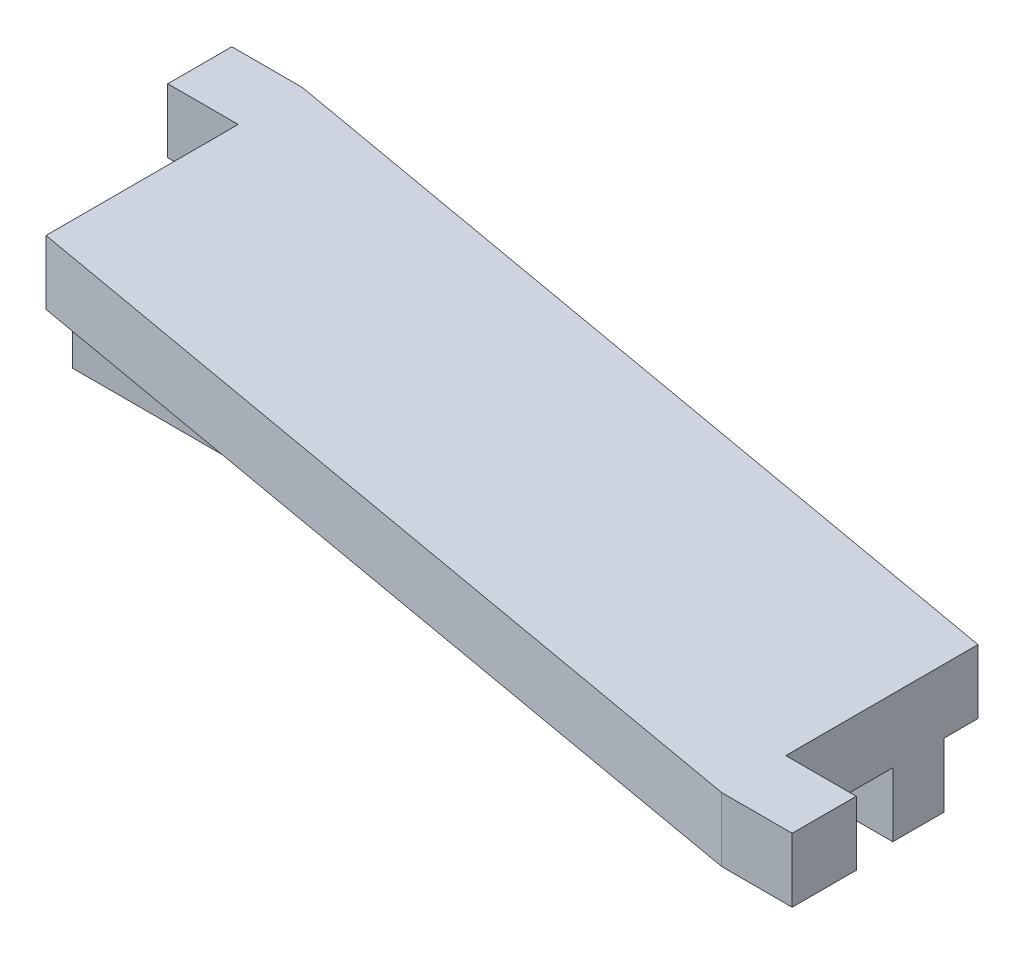
ISO-10303-21;
HEADER;
FILE_DESCRIPTION(('STEP AP214'),'2;1');
FILE_NAME('part.step','',(''),(''),'','','');
FILE_SCHEMA(('AUTOMOTIVE_DESIGN { 1 0 10303 214 1 1 1 1 }'));
ENDSEC;
DATA;
#1=APPLICATION_CONTEXT('core data for automotive mechanical design processes');
#2=APPLICATION_PROTOCOL_DEFINITION('international standard','automotive_design',2000,#1);
#3=PRODUCT_CONTEXT('',#1,'mechanical');
#4=PRODUCT('Part','Part','',(#3));
#5=PRODUCT_RELATED_PRODUCT_CATEGORY('part','',(#4));
#6=PRODUCT_DEFINITION_FORMATION('','',#4);
#7=PRODUCT_DEFINITION_CONTEXT('part definition',#1,'design');
#8=PRODUCT_DEFINITION('design','',#6,#7);
#9=PRODUCT_DEFINITION_SHAPE('','',#8);
#10=(LENGTH_UNIT() NAMED_UNIT(*) SI_UNIT(.MILLI.,.METRE.));
#11=(NAMED_UNIT(*) PLANE_ANGLE_UNIT() SI_UNIT($,.RADIAN.));
#12=(NAMED_UNIT(*) SI_UNIT($,.STERADIAN.) SOLID_ANGLE_UNIT());
#13=UNCERTAINTY_MEASURE_WITH_UNIT(LENGTH_MEASURE(1.E-05),#10,'distance_accuracy_value','');
#14=(GEOMETRIC_REPRESENTATION_CONTEXT(3) GLOBAL_UNCERTAINTY_ASSIGNED_CONTEXT((#13)) GLOBAL_UNIT_ASSIGNED_CONTEXT((#10,
#11,#12)) REPRESENTATION_CONTEXT('',''));
#15=CARTESIAN_POINT('',(0.,0.,0.));
#16=DIRECTION('',(0.,0.,1.));
#17=DIRECTION('',(1.,0.,0.));
#18=AXIS2_PLACEMENT_3D('',#15,#16,#17);
#19=CARTESIAN_POINT('',(0.,0.,0.));
#20=DIRECTION('',(0.,-1.,0.));
#21=DIRECTION('',(0.,0.,-1.));
#22=AXIS2_PLACEMENT_3D('',#19,#20,#21);
#23=PLANE('',#22);
#24=DIRECTION('',(1.,0.,0.));
#25=VECTOR('',#24,1.);
#26=CARTESIAN_POINT('',(0.,0.,-34.7));
#27=LINE('',#26,#25);
#28=CARTESIAN_POINT('',(-128.025007891587,0.,-34.7));
#29=VERTEX_POINT('',#28);
#30=CARTESIAN_POINT('',(0.,0.,-34.7));
#31=VERTEX_POINT('',#30);
#32=EDGE_CURVE('E171',#29,#31,#27,.T.);
#33=ORIENTED_EDGE('',*,*,#32,.F.);
#34=DIRECTION('',(0.,0.,1.));
#35=VECTOR('',#34,1.);
#36=CARTESIAN_POINT('',(-128.025007891587,0.,-22.574263096701));
#37=LINE('',#36,#35);
#38=CARTESIAN_POINT('',(-128.025007891587,0.,-52.5742630967009));
#39=VERTEX_POINT('',#38);
#40=EDGE_CURVE('E241',#39,#29,#37,.T.);
#41=ORIENTED_EDGE('',*,*,#40,.F.);
#42=DIRECTION('',(1.,0.,0.));
#43=VECTOR('',#42,1.);
#44=CARTESIAN_POINT('',(-128.025007891587,0.,-52.5742630967009));
#45=LINE('',#44,#43);
#46=CARTESIAN_POINT('',(-139.025007891587,0.,-52.5742630967009));
#47=VERTEX_POINT('',#46);
#48=EDGE_CURVE('E237',#47,#39,#45,.T.);
#49=ORIENTED_EDGE('',*,*,#48,.F.);
#50=DIRECTION('',(0.,0.,1.));
#51=VECTOR('',#50,1.);
#52=CARTESIAN_POINT('',(-139.025007891587,0.,-52.5742630967009));
#53=LINE('',#52,#51);
#54=CARTESIAN_POINT('',(-139.025007891587,0.,-62.5742630967009));
#55=VERTEX_POINT('',#54);
#56=EDGE_CURVE('E234',#55,#47,#53,.T.);
#57=ORIENTED_EDGE('',*,*,#56,.F.);
#58=DIRECTION('',(-1.,0.,0.));
#59=VECTOR('',#58,1.);
#60=CARTESIAN_POINT('',(-139.025007891587,0.,-62.5742630967009));
#61=LINE('',#60,#59);
#62=CARTESIAN_POINT('',(-128.025007891587,0.,-62.5742630967009));
#63=VERTEX_POINT('',#62);
#64=EDGE_CURVE('E231',#63,#55,#61,.T.);
#65=ORIENTED_EDGE('',*,*,#64,.F.);
#66=DIRECTION('',(-0.984807753012208,0.,-0.17364817766693));
#67=VECTOR('',#66,1.);
#68=CARTESIAN_POINT('',(-128.025007891587,0.,-62.5742630967009));
#69=LINE('',#68,#67);
#70=CARTESIAN_POINT('',(0.,0.,-40.));
#71=VERTEX_POINT('',#70);
#72=EDGE_CURVE('E228',#71,#63,#69,.T.);
#73=ORIENTED_EDGE('',*,*,#72,.F.);
#74=DIRECTION('',(0.,0.,-1.));
#75=VECTOR('',#74,1.);
#76=CARTESIAN_POINT('',(0.,0.,-40.));
#77=LINE('',#76,#75);
#78=EDGE_CURVE('E63',#31,#71,#77,.T.);
#79=ORIENTED_EDGE('',*,*,#78,.F.);
#80=EDGE_LOOP('',(#33,#41,#49,#57,#65,#73,#79));
#81=FACE_BOUND('',#80,.T.);
#82=ADVANCED_FACE('F47',(#81),#23,.T.);
#83=CARTESIAN_POINT('',(11.,10.,0.));
#84=DIRECTION('',(0.,0.,-1.));
#85=DIRECTION('',(-1.,0.,0.));
#86=AXIS2_PLACEMENT_3D('',#83,#84,#85);
#87=PLANE('',#86);
#88=DIRECTION('',(1.,0.,0.));
#89=VECTOR('',#88,1.);
#90=CARTESIAN_POINT('',(11.,0.,0.));
#91=LINE('',#90,#89);
#92=CARTESIAN_POINT('',(0.,0.,0.));
#93=VERTEX_POINT('',#92);
#94=CARTESIAN_POINT('',(11.,0.,0.));
#95=VERTEX_POINT('',#94);
#96=EDGE_CURVE('E177',#93,#95,#91,.T.);
#97=ORIENTED_EDGE('',*,*,#96,.T.);
#98=DIRECTION('',(0.,-1.,0.));
#99=VECTOR('',#98,1.);
#100=CARTESIAN_POINT('',(11.,10.,0.));
#101=LINE('',#100,#99);
#102=CARTESIAN_POINT('',(11.,10.,0.));
#103=VERTEX_POINT('',#102);
#104=EDGE_CURVE('E11',#103,#95,#101,.T.);
#105=ORIENTED_EDGE('',*,*,#104,.F.);
#106=DIRECTION('',(1.,0.,0.));
#107=VECTOR('',#106,1.);
#108=CARTESIAN_POINT('',(11.,10.,0.));
#109=LINE('',#108,#107);
#110=CARTESIAN_POINT('',(0.,10.,0.));
#111=VERTEX_POINT('',#110);
#112=EDGE_CURVE('E188',#111,#103,#109,.T.);
#113=ORIENTED_EDGE('',*,*,#112,.F.);
#114=DIRECTION('',(0.,-1.,0.));
#115=VECTOR('',#114,1.);
#116=CARTESIAN_POINT('',(0.,10.,0.));
#117=LINE('',#116,#115);
#118=EDGE_CURVE('E219',#111,#93,#117,.T.);
#119=ORIENTED_EDGE('',*,*,#118,.T.);
#120=EDGE_LOOP('',(#97,#105,#113,#119));
#121=FACE_BOUND('',#120,.T.);
#122=ADVANCED_FACE('F49',(#121),#87,.F.);
#123=CARTESIAN_POINT('',(11.,10.,-9.99999999999999));
#124=DIRECTION('',(-1.,0.,0.));
#125=DIRECTION('',(0.,0.,1.));
#126=AXIS2_PLACEMENT_3D('',#123,#124,#125);
#127=PLANE('',#126);
#128=DIRECTION('',(0.,0.,-1.));
#129=VECTOR('',#128,1.);
#130=CARTESIAN_POINT('',(11.,0.,-9.99999999999999));
#131=LINE('',#130,#129);
#132=CARTESIAN_POINT('',(11.,0.,-9.99999999999999));
#133=VERTEX_POINT('',#132);
#134=EDGE_CURVE('E182',#95,#133,#131,.T.);
#135=ORIENTED_EDGE('',*,*,#134,.T.);
#136=DIRECTION('',(0.,-1.,0.));
#137=VECTOR('',#136,1.);
#138=CARTESIAN_POINT('',(11.,10.,-9.99999999999999));
#139=LINE('',#138,#137);
#140=CARTESIAN_POINT('',(11.,10.,-9.99999999999999));
#141=VERTEX_POINT('',#140);
#142=EDGE_CURVE('E56',#141,#133,#139,.T.);
#143=ORIENTED_EDGE('',*,*,#142,.F.);
#144=DIRECTION('',(0.,0.,-1.));
#145=VECTOR('',#144,1.);
#146=CARTESIAN_POINT('',(11.,10.,-9.99999999999999));
#147=LINE('',#146,#145);
#148=EDGE_CURVE('E192',#103,#141,#147,.T.);
#149=ORIENTED_EDGE('',*,*,#148,.F.);
#150=ORIENTED_EDGE('',*,*,#104,.T.);
#151=EDGE_LOOP('',(#135,#143,#149,#150));
#152=FACE_BOUND('',#151,.T.);
#153=ADVANCED_FACE('F289',(#152),#127,.F.);
#154=CARTESIAN_POINT('',(0.,10.,-10.));
#155=DIRECTION('',(0.,0.,1.));
#156=DIRECTION('',(1.,0.,0.));
#157=AXIS2_PLACEMENT_3D('',#154,#155,#156);
#158=PLANE('',#157);
#159=DIRECTION('',(-1.,0.,0.));
#160=VECTOR('',#159,1.);
#161=CARTESIAN_POINT('',(0.,0.,-10.));
#162=LINE('',#161,#160);
#163=CARTESIAN_POINT('',(0.,0.,-10.));
#164=VERTEX_POINT('',#163);
#165=EDGE_CURVE('E223',#133,#164,#162,.T.);
#166=ORIENTED_EDGE('',*,*,#165,.T.);
#167=DIRECTION('',(0.,-1.,0.));
#168=VECTOR('',#167,1.);
#169=CARTESIAN_POINT('',(0.,10.,-10.));
#170=LINE('',#169,#168);
#171=CARTESIAN_POINT('',(0.,10.,-10.));
#172=VERTEX_POINT('',#171);
#173=EDGE_CURVE('E274',#172,#164,#170,.T.);
#174=ORIENTED_EDGE('',*,*,#173,.F.);
#175=DIRECTION('',(-1.,0.,0.));
#176=VECTOR('',#175,1.);
#177=CARTESIAN_POINT('',(0.,10.,-10.));
#178=LINE('',#177,#176);
#179=EDGE_CURVE('E196',#141,#172,#178,.T.);
#180=ORIENTED_EDGE('',*,*,#179,.F.);
#181=ORIENTED_EDGE('',*,*,#142,.T.);
#182=EDGE_LOOP('',(#166,#174,#180,#181));
#183=FACE_BOUND('',#182,.T.);
#184=ADVANCED_FACE('F282',(#183),#158,.F.);
#185=CARTESIAN_POINT('',(0.,10.,-40.));
#186=DIRECTION('',(-1.,0.,0.));
#187=DIRECTION('',(0.,0.,1.));
#188=AXIS2_PLACEMENT_3D('',#185,#186,#187);
#189=PLANE('',#188);
#190=CARTESIAN_POINT('',(0.,0.,-26.7));
#191=VERTEX_POINT('',#190);
#192=EDGE_CURVE('E175',#164,#191,#77,.T.);
#193=ORIENTED_EDGE('',*,*,#192,.T.);
#194=DIRECTION('',(0.,1.,0.));
#195=VECTOR('',#194,1.);
#196=CARTESIAN_POINT('',(0.,-10.,-26.7));
#197=LINE('',#196,#195);
#198=CARTESIAN_POINT('',(0.,-10.,-26.7));
#199=VERTEX_POINT('',#198);
#200=EDGE_CURVE('E154',#199,#191,#197,.T.);
#201=ORIENTED_EDGE('',*,*,#200,.F.);
#202=DIRECTION('',(0.,0.,1.));
#203=VECTOR('',#202,1.);
#204=CARTESIAN_POINT('',(0.,-10.,-34.7));
#205=LINE('',#204,#203);
#206=CARTESIAN_POINT('',(0.,-10.,-34.7));
#207=VERTEX_POINT('',#206);
#208=EDGE_CURVE('E161',#207,#199,#205,.T.);
#209=ORIENTED_EDGE('',*,*,#208,.F.);
#210=DIRECTION('',(0.,1.,0.));
#211=VECTOR('',#210,1.);
#212=CARTESIAN_POINT('',(0.,-10.,-34.7));
#213=LINE('',#212,#211);
#214=EDGE_CURVE('E307',#207,#31,#213,.T.);
#215=ORIENTED_EDGE('',*,*,#214,.T.);
#216=ORIENTED_EDGE('',*,*,#78,.T.);
#217=DIRECTION('',(0.,-1.,0.));
#218=VECTOR('',#217,1.);
#219=CARTESIAN_POINT('',(0.,10.,-40.));
#220=LINE('',#219,#218);
#221=CARTESIAN_POINT('',(0.,10.,-40.));
#222=VERTEX_POINT('',#221);
#223=EDGE_CURVE('E270',#222,#71,#220,.T.);
#224=ORIENTED_EDGE('',*,*,#223,.F.);
#225=DIRECTION('',(0.,0.,-1.));
#226=VECTOR('',#225,1.);
#227=CARTESIAN_POINT('',(0.,10.,-40.));
#228=LINE('',#227,#226);
#229=EDGE_CURVE('E199',#172,#222,#228,.T.);
#230=ORIENTED_EDGE('',*,*,#229,.F.);
#231=ORIENTED_EDGE('',*,*,#173,.T.);
#232=EDGE_LOOP('',(#193,#201,#209,#215,#216,#224,#230,#231));
#233=FACE_BOUND('',#232,.T.);
#234=ADVANCED_FACE('F173',(#233),#189,.F.);
#235=CARTESIAN_POINT('',(-128.025007891587,10.,-62.5742630967009));
#236=DIRECTION('',(-0.17364817766693,0.,0.984807753012208));
#237=DIRECTION('',(0.984807753012208,0.,0.17364817766693));
#238=AXIS2_PLACEMENT_3D('',#235,#236,#237);
#239=PLANE('',#238);
#240=ORIENTED_EDGE('',*,*,#72,.T.);
#241=DIRECTION('',(0.,-1.,0.));
#242=VECTOR('',#241,1.);
#243=CARTESIAN_POINT('',(-128.025007891587,10.,-62.5742630967009));
#244=LINE('',#243,#242);
#245=CARTESIAN_POINT('',(-128.025007891587,10.,-62.5742630967009));
#246=VERTEX_POINT('',#245);
#247=EDGE_CURVE('E266',#246,#63,#244,.T.);
#248=ORIENTED_EDGE('',*,*,#247,.F.);
#249=DIRECTION('',(-0.984807753012208,0.,-0.17364817766693));
#250=VECTOR('',#249,1.);
#251=CARTESIAN_POINT('',(-128.025007891587,10.,-62.5742630967009));
#252=LINE('',#251,#250);
#253=EDGE_CURVE('E202',#222,#246,#252,.T.);
#254=ORIENTED_EDGE('',*,*,#253,.F.);
#255=ORIENTED_EDGE('',*,*,#223,.T.);
#256=EDGE_LOOP('',(#240,#248,#254,#255));
#257=FACE_BOUND('',#256,.T.);
#258=ADVANCED_FACE('F321',(#257),#239,.F.);
#259=CARTESIAN_POINT('',(-139.025007891587,10.,-62.5742630967009));
#260=DIRECTION('',(0.,0.,1.));
#261=DIRECTION('',(1.,0.,0.));
#262=AXIS2_PLACEMENT_3D('',#259,#260,#261);
#263=PLANE('',#262);
#264=ORIENTED_EDGE('',*,*,#64,.T.);
#265=DIRECTION('',(0.,-1.,0.));
#266=VECTOR('',#265,1.);
#267=CARTESIAN_POINT('',(-139.025007891587,10.,-62.5742630967009));
#268=LINE('',#267,#266);
#269=CARTESIAN_POINT('',(-139.025007891587,10.,-62.5742630967009));
#270=VERTEX_POINT('',#269);
#271=EDGE_CURVE('E262',#270,#55,#268,.T.);
#272=ORIENTED_EDGE('',*,*,#271,.F.);
#273=DIRECTION('',(-1.,0.,0.));
#274=VECTOR('',#273,1.);
#275=CARTESIAN_POINT('',(-139.025007891587,10.,-62.5742630967009));
#276=LINE('',#275,#274);
#277=EDGE_CURVE('E205',#246,#270,#276,.T.);
#278=ORIENTED_EDGE('',*,*,#277,.F.);
#279=ORIENTED_EDGE('',*,*,#247,.T.);
#280=EDGE_LOOP('',(#264,#272,#278,#279));
#281=FACE_BOUND('',#280,.T.);
#282=ADVANCED_FACE('F328',(#281),#263,.F.);
#283=CARTESIAN_POINT('',(-139.025007891587,10.,-52.5742630967009));
#284=DIRECTION('',(1.,0.,0.));
#285=DIRECTION('',(0.,0.,-1.));
#286=AXIS2_PLACEMENT_3D('',#283,#284,#285);
#287=PLANE('',#286);
#288=ORIENTED_EDGE('',*,*,#56,.T.);
#289=DIRECTION('',(0.,-1.,0.));
#290=VECTOR('',#289,1.);
#291=CARTESIAN_POINT('',(-139.025007891587,10.,-52.5742630967009));
#292=LINE('',#291,#290);
#293=CARTESIAN_POINT('',(-139.025007891587,10.,-52.5742630967009));
#294=VERTEX_POINT('',#293);
#295=EDGE_CURVE('E258',#294,#47,#292,.T.);
#296=ORIENTED_EDGE('',*,*,#295,.F.);
#297=DIRECTION('',(0.,0.,1.));
#298=VECTOR('',#297,1.);
#299=CARTESIAN_POINT('',(-139.025007891587,10.,-52.5742630967009));
#300=LINE('',#299,#298);
#301=EDGE_CURVE('E208',#270,#294,#300,.T.);
#302=ORIENTED_EDGE('',*,*,#301,.F.);
#303=ORIENTED_EDGE('',*,*,#271,.T.);
#304=EDGE_LOOP('',(#288,#296,#302,#303));
#305=FACE_BOUND('',#304,.T.);
#306=ADVANCED_FACE('F332',(#305),#287,.F.);
#307=CARTESIAN_POINT('',(-128.025007891587,10.,-52.5742630967009));
#308=DIRECTION('',(0.,0.,-1.));
#309=DIRECTION('',(-1.,0.,0.));
#310=AXIS2_PLACEMENT_3D('',#307,#308,#309);
#311=PLANE('',#310);
#312=ORIENTED_EDGE('',*,*,#48,.T.);
#313=DIRECTION('',(0.,-1.,0.));
#314=VECTOR('',#313,1.);
#315=CARTESIAN_POINT('',(-128.025007891587,10.,-52.5742630967009));
#316=LINE('',#315,#314);
#317=CARTESIAN_POINT('',(-128.025007891587,10.,-52.5742630967009));
#318=VERTEX_POINT('',#317);
#319=EDGE_CURVE('E254',#318,#39,#316,.T.);
#320=ORIENTED_EDGE('',*,*,#319,.F.);
#321=DIRECTION('',(1.,0.,0.));
#322=VECTOR('',#321,1.);
#323=CARTESIAN_POINT('',(-128.025007891587,10.,-52.5742630967009));
#324=LINE('',#323,#322);
#325=EDGE_CURVE('E211',#294,#318,#324,.T.);
#326=ORIENTED_EDGE('',*,*,#325,.F.);
#327=ORIENTED_EDGE('',*,*,#295,.T.);
#328=EDGE_LOOP('',(#312,#320,#326,#327));
#329=FACE_BOUND('',#328,.T.);
#330=ADVANCED_FACE('F341',(#329),#311,.F.);
#331=CARTESIAN_POINT('',(-128.025007891587,10.,-22.574263096701));
#332=DIRECTION('',(1.,0.,0.));
#333=DIRECTION('',(0.,0.,-1.));
#334=AXIS2_PLACEMENT_3D('',#331,#332,#333);
#335=PLANE('',#334);
#336=ORIENTED_EDGE('',*,*,#40,.T.);
#337=DIRECTION('',(0.,1.,0.));
#338=VECTOR('',#337,1.);
#339=CARTESIAN_POINT('',(-128.025007891587,-10.,-34.7));
#340=LINE('',#339,#338);
#341=CARTESIAN_POINT('',(-128.025007891587,-10.,-34.7));
#342=VERTEX_POINT('',#341);
#343=EDGE_CURVE('E184',#342,#29,#340,.T.);
#344=ORIENTED_EDGE('',*,*,#343,.F.);
#345=DIRECTION('',(0.,0.,-1.));
#346=VECTOR('',#345,1.);
#347=CARTESIAN_POINT('',(-128.025007891587,-10.,-34.7));
#348=LINE('',#347,#346);
#349=CARTESIAN_POINT('',(-128.025007891587,-10.,-26.7));
#350=VERTEX_POINT('',#349);
#351=EDGE_CURVE('E160',#350,#342,#348,.T.);
#352=ORIENTED_EDGE('',*,*,#351,.F.);
#353=DIRECTION('',(0.,1.,0.));
#354=VECTOR('',#353,1.);
#355=CARTESIAN_POINT('',(-128.025007891587,-10.,-26.7));
#356=LINE('',#355,#354);
#357=CARTESIAN_POINT('',(-128.025007891587,0.,-26.7));
#358=VERTEX_POINT('',#357);
#359=EDGE_CURVE('E156',#350,#358,#356,.T.);
#360=ORIENTED_EDGE('',*,*,#359,.T.);
#361=CARTESIAN_POINT('',(-128.025007891587,0.,-22.574263096701));
#362=VERTEX_POINT('',#361);
#363=EDGE_CURVE('E240',#358,#362,#37,.T.);
#364=ORIENTED_EDGE('',*,*,#363,.T.);
#365=DIRECTION('',(0.,-1.,0.));
#366=VECTOR('',#365,1.);
#367=CARTESIAN_POINT('',(-128.025007891587,10.,-22.574263096701));
#368=LINE('',#367,#366);
#369=CARTESIAN_POINT('',(-128.025007891587,10.,-22.574263096701));
#370=VERTEX_POINT('',#369);
#371=EDGE_CURVE('E250',#370,#362,#368,.T.);
#372=ORIENTED_EDGE('',*,*,#371,.F.);
#373=DIRECTION('',(0.,0.,1.));
#374=VECTOR('',#373,1.);
#375=CARTESIAN_POINT('',(-128.025007891587,10.,-22.574263096701));
#376=LINE('',#375,#374);
#377=EDGE_CURVE('E214',#318,#370,#376,.T.);
#378=ORIENTED_EDGE('',*,*,#377,.F.);
#379=ORIENTED_EDGE('',*,*,#319,.T.);
#380=EDGE_LOOP('',(#336,#344,#352,#360,#364,#372,#378,#379));
#381=FACE_BOUND('',#380,.T.);
#382=ADVANCED_FACE('F301',(#381),#335,.F.);
#383=CARTESIAN_POINT('',(0.,10.,0.));
#384=DIRECTION('',(0.17364817766693,0.,-0.984807753012208));
#385=DIRECTION('',(-0.984807753012208,0.,-0.17364817766693));
#386=AXIS2_PLACEMENT_3D('',#383,#384,#385);
#387=PLANE('',#386);
#388=DIRECTION('',(0.984807753012208,0.,0.17364817766693));
#389=VECTOR('',#388,1.);
#390=CARTESIAN_POINT('',(0.,0.,0.));
#391=LINE('',#390,#389);
#392=EDGE_CURVE('E193',#362,#93,#391,.T.);
#393=ORIENTED_EDGE('',*,*,#392,.T.);
#394=ORIENTED_EDGE('',*,*,#118,.F.);
#395=DIRECTION('',(0.984807753012208,0.,0.17364817766693));
#396=VECTOR('',#395,1.);
#397=CARTESIAN_POINT('',(0.,10.,0.));
#398=LINE('',#397,#396);
#399=EDGE_CURVE('E217',#370,#111,#398,.T.);
#400=ORIENTED_EDGE('',*,*,#399,.F.);
#401=ORIENTED_EDGE('',*,*,#371,.T.);
#402=EDGE_LOOP('',(#393,#394,#400,#401));
#403=FACE_BOUND('',#402,.T.);
#404=ADVANCED_FACE('F295',(#403),#387,.F.);
#405=CARTESIAN_POINT('',(0.,10.,0.));
#406=DIRECTION('',(0.,-1.,0.));
#407=DIRECTION('',(0.,0.,-1.));
#408=AXIS2_PLACEMENT_3D('',#405,#406,#407);
#409=PLANE('',#408);
#410=ORIENTED_EDGE('',*,*,#112,.T.);
#411=ORIENTED_EDGE('',*,*,#148,.T.);
#412=ORIENTED_EDGE('',*,*,#179,.T.);
#413=ORIENTED_EDGE('',*,*,#229,.T.);
#414=ORIENTED_EDGE('',*,*,#253,.T.);
#415=ORIENTED_EDGE('',*,*,#277,.T.);
#416=ORIENTED_EDGE('',*,*,#301,.T.);
#417=ORIENTED_EDGE('',*,*,#325,.T.);
#418=ORIENTED_EDGE('',*,*,#377,.T.);
#419=ORIENTED_EDGE('',*,*,#399,.T.);
#420=EDGE_LOOP('',(#410,#411,#412,#413,#414,#415,#416,#417,#418,#419));
#421=FACE_BOUND('',#420,.T.);
#422=ADVANCED_FACE('F336',(#421),#409,.F.);
#423=DIRECTION('',(-1.,0.,0.));
#424=VECTOR('',#423,1.);
#425=CARTESIAN_POINT('',(0.,0.,-26.7));
#426=LINE('',#425,#424);
#427=EDGE_CURVE('E71',#191,#358,#426,.T.);
#428=ORIENTED_EDGE('',*,*,#427,.F.);
#429=ORIENTED_EDGE('',*,*,#192,.F.);
#430=ORIENTED_EDGE('',*,*,#165,.F.);
#431=ORIENTED_EDGE('',*,*,#134,.F.);
#432=ORIENTED_EDGE('',*,*,#96,.F.);
#433=ORIENTED_EDGE('',*,*,#392,.F.);
#434=ORIENTED_EDGE('',*,*,#363,.F.);
#435=EDGE_LOOP('',(#428,#429,#430,#431,#432,#433,#434));
#436=FACE_BOUND('',#435,.T.);
#437=ADVANCED_FACE('F285',(#436),#23,.T.);
#438=CARTESIAN_POINT('',(0.,-10.,-26.7));
#439=DIRECTION('',(0.,0.,-1.));
#440=DIRECTION('',(-1.,0.,0.));
#441=AXIS2_PLACEMENT_3D('',#438,#439,#440);
#442=PLANE('',#441);
#443=ORIENTED_EDGE('',*,*,#427,.T.);
#444=ORIENTED_EDGE('',*,*,#359,.F.);
#445=DIRECTION('',(-1.,0.,0.));
#446=VECTOR('',#445,1.);
#447=CARTESIAN_POINT('',(0.,-10.,-26.7));
#448=LINE('',#447,#446);
#449=EDGE_CURVE('E150',#199,#350,#448,.T.);
#450=ORIENTED_EDGE('',*,*,#449,.F.);
#451=ORIENTED_EDGE('',*,*,#200,.T.);
#452=EDGE_LOOP('',(#443,#444,#450,#451));
#453=FACE_BOUND('',#452,.T.);
#454=ADVANCED_FACE('F152',(#453),#442,.F.);
#455=CARTESIAN_POINT('',(0.,-10.,-34.7));
#456=DIRECTION('',(0.,0.,1.));
#457=DIRECTION('',(1.,0.,0.));
#458=AXIS2_PLACEMENT_3D('',#455,#456,#457);
#459=PLANE('',#458);
#460=ORIENTED_EDGE('',*,*,#32,.T.);
#461=ORIENTED_EDGE('',*,*,#214,.F.);
#462=DIRECTION('',(1.,0.,0.));
#463=VECTOR('',#462,1.);
#464=CARTESIAN_POINT('',(0.,-10.,-34.7));
#465=LINE('',#464,#463);
#466=EDGE_CURVE('E166',#342,#207,#465,.T.);
#467=ORIENTED_EDGE('',*,*,#466,.F.);
#468=ORIENTED_EDGE('',*,*,#343,.T.);
#469=EDGE_LOOP('',(#460,#461,#467,#468));
#470=FACE_BOUND('',#469,.T.);
#471=ADVANCED_FACE('F315',(#470),#459,.F.);
#472=CARTESIAN_POINT('',(0.,-10.,0.));
#473=DIRECTION('',(0.,-1.,0.));
#474=DIRECTION('',(0.,0.,-1.));
#475=AXIS2_PLACEMENT_3D('',#472,#473,#474);
#476=PLANE('',#475);
#477=ORIENTED_EDGE('',*,*,#208,.T.);
#478=ORIENTED_EDGE('',*,*,#449,.T.);
#479=ORIENTED_EDGE('',*,*,#351,.T.);
#480=ORIENTED_EDGE('',*,*,#466,.T.);
#481=EDGE_LOOP('',(#477,#478,#479,#480));
#482=FACE_BOUND('',#481,.T.);
#483=ADVANCED_FACE('F164',(#482),#476,.T.);
#484=CLOSED_SHELL('',(#82,#122,#153,#184,#234,#258,#282,#306,#330,#382,#404,#422,#437,#454,#471,#483));
#485=MANIFOLD_SOLID_BREP('B2',#484);
#486=ADVANCED_BREP_SHAPE_REPRESENTATION('',(#18,#485),#14);
#487=SHAPE_DEFINITION_REPRESENTATION(#9,#486);
ENDSEC;
END-ISO-10303-21;
